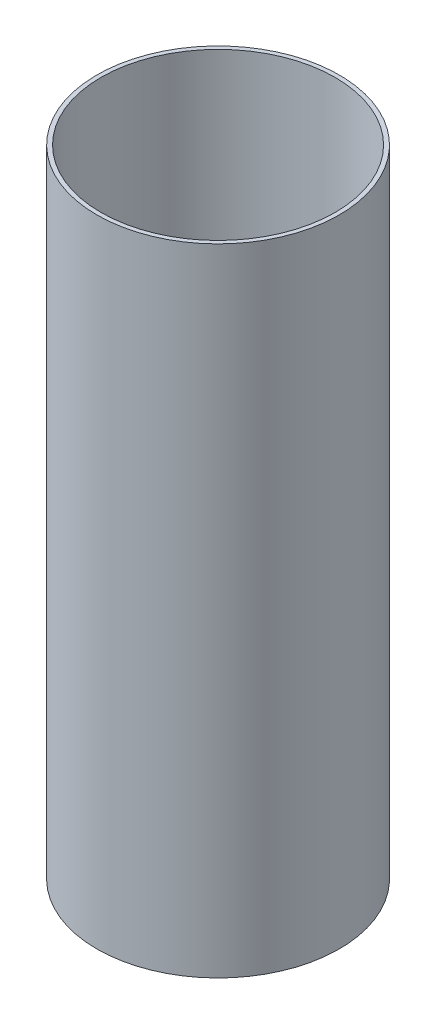
ISO-10303-21;
HEADER;
FILE_DESCRIPTION(('STEP AP214'),'2;1');
FILE_NAME('part.step','',(''),(''),'','','');
FILE_SCHEMA(('AUTOMOTIVE_DESIGN { 1 0 10303 214 1 1 1 1 }'));
ENDSEC;
DATA;
#1=APPLICATION_CONTEXT('core data for automotive mechanical design processes');
#2=APPLICATION_PROTOCOL_DEFINITION('international standard','automotive_design',2000,#1);
#3=PRODUCT_CONTEXT('',#1,'mechanical');
#4=PRODUCT('Part','Part','',(#3));
#5=PRODUCT_RELATED_PRODUCT_CATEGORY('part','',(#4));
#6=PRODUCT_DEFINITION_FORMATION('','',#4);
#7=PRODUCT_DEFINITION_CONTEXT('part definition',#1,'design');
#8=PRODUCT_DEFINITION('design','',#6,#7);
#9=PRODUCT_DEFINITION_SHAPE('','',#8);
#10=(LENGTH_UNIT() NAMED_UNIT(*) SI_UNIT(.MILLI.,.METRE.));
#11=(NAMED_UNIT(*) PLANE_ANGLE_UNIT() SI_UNIT($,.RADIAN.));
#12=(NAMED_UNIT(*) SI_UNIT($,.STERADIAN.) SOLID_ANGLE_UNIT());
#13=UNCERTAINTY_MEASURE_WITH_UNIT(LENGTH_MEASURE(1.E-05),#10,'distance_accuracy_value','');
#14=(GEOMETRIC_REPRESENTATION_CONTEXT(3) GLOBAL_UNCERTAINTY_ASSIGNED_CONTEXT((#13)) GLOBAL_UNIT_ASSIGNED_CONTEXT((#10,
#11,#12)) REPRESENTATION_CONTEXT('',''));
#15=CARTESIAN_POINT('',(0.,0.,0.));
#16=DIRECTION('',(0.,0.,1.));
#17=DIRECTION('',(1.,0.,0.));
#18=AXIS2_PLACEMENT_3D('',#15,#16,#17);
#19=CARTESIAN_POINT('',(0.,241.427,0.));
#20=DIRECTION('',(0.,1.,0.));
#21=DIRECTION('',(0.,0.,1.));
#22=AXIS2_PLACEMENT_3D('',#19,#20,#21);
#23=PLANE('',#22);
#24=CARTESIAN_POINT('',(0.,241.427,0.));
#25=DIRECTION('',(0.,1.,0.));
#26=DIRECTION('',(0.,0.,1.));
#27=AXIS2_PLACEMENT_3D('',#24,#25,#26);
#28=CIRCLE('',#27,92.075);
#29=CARTESIAN_POINT('',(0.,241.427,92.075));
#30=VERTEX_POINT('',#29);
#31=EDGE_CURVE('E10',#30,#30,#28,.T.);
#32=ORIENTED_EDGE('',*,*,#31,.T.);
#33=EDGE_LOOP('',(#32));
#34=FACE_BOUND('',#33,.T.);
#35=CARTESIAN_POINT('',(0.,241.427,0.));
#36=DIRECTION('',(0.,1.,0.));
#37=DIRECTION('',(0.,0.,1.));
#38=AXIS2_PLACEMENT_3D('',#35,#36,#37);
#39=CIRCLE('',#38,88.9);
#40=CARTESIAN_POINT('',(0.,241.427,88.9));
#41=VERTEX_POINT('',#40);
#42=EDGE_CURVE('E52',#41,#41,#39,.T.);
#43=ORIENTED_EDGE('',*,*,#42,.F.);
#44=EDGE_LOOP('',(#43));
#45=FACE_BOUND('',#44,.T.);
#46=ADVANCED_FACE('F41',(#34,#45),#23,.T.);
#47=CARTESIAN_POINT('',(0.,-241.427,0.));
#48=DIRECTION('',(0.,1.,0.));
#49=DIRECTION('',(0.,0.,1.));
#50=AXIS2_PLACEMENT_3D('',#47,#48,#49);
#51=PLANE('',#50);
#52=CARTESIAN_POINT('',(0.,-241.427,0.));
#53=DIRECTION('',(0.,1.,0.));
#54=DIRECTION('',(0.,0.,1.));
#55=AXIS2_PLACEMENT_3D('',#52,#53,#54);
#56=CIRCLE('',#55,92.075);
#57=CARTESIAN_POINT('',(0.,-241.427,92.075));
#58=VERTEX_POINT('',#57);
#59=EDGE_CURVE('E45',#58,#58,#56,.T.);
#60=ORIENTED_EDGE('',*,*,#59,.F.);
#61=EDGE_LOOP('',(#60));
#62=FACE_BOUND('',#61,.T.);
#63=CARTESIAN_POINT('',(0.,-241.427,0.));
#64=DIRECTION('',(0.,1.,0.));
#65=DIRECTION('',(0.,0.,1.));
#66=AXIS2_PLACEMENT_3D('',#63,#64,#65);
#67=CIRCLE('',#66,88.9);
#68=CARTESIAN_POINT('',(0.,-241.427,88.9));
#69=VERTEX_POINT('',#68);
#70=EDGE_CURVE('E54',#69,#69,#67,.T.);
#71=ORIENTED_EDGE('',*,*,#70,.T.);
#72=EDGE_LOOP('',(#71));
#73=FACE_BOUND('',#72,.T.);
#74=ADVANCED_FACE('F64',(#62,#73),#51,.F.);
#75=CARTESIAN_POINT('',(0.,241.427,0.));
#76=DIRECTION('',(0.,-1.,0.));
#77=DIRECTION('',(0.,0.,-1.));
#78=AXIS2_PLACEMENT_3D('',#75,#76,#77);
#79=CYLINDRICAL_SURFACE('',#78,92.075);
#80=ORIENTED_EDGE('',*,*,#31,.F.);
#81=EDGE_LOOP('',(#80));
#82=FACE_BOUND('',#81,.T.);
#83=ORIENTED_EDGE('',*,*,#59,.T.);
#84=EDGE_LOOP('',(#83));
#85=FACE_BOUND('',#84,.T.);
#86=ADVANCED_FACE('F43',(#82,#85),#79,.T.);
#87=CARTESIAN_POINT('',(0.,241.427,0.));
#88=DIRECTION('',(0.,-1.,0.));
#89=DIRECTION('',(0.,0.,-1.));
#90=AXIS2_PLACEMENT_3D('',#87,#88,#89);
#91=CYLINDRICAL_SURFACE('',#90,88.9);
#92=ORIENTED_EDGE('',*,*,#42,.T.);
#93=EDGE_LOOP('',(#92));
#94=FACE_BOUND('',#93,.T.);
#95=ORIENTED_EDGE('',*,*,#70,.F.);
#96=EDGE_LOOP('',(#95));
#97=FACE_BOUND('',#96,.T.);
#98=ADVANCED_FACE('F60',(#94,#97),#91,.F.);
#99=CLOSED_SHELL('',(#46,#74,#86,#98));
#100=MANIFOLD_SOLID_BREP('B2',#99);
#101=ADVANCED_BREP_SHAPE_REPRESENTATION('',(#18,#100),#14);
#102=SHAPE_DEFINITION_REPRESENTATION(#9,#101);
ENDSEC;
END-ISO-10303-21;
